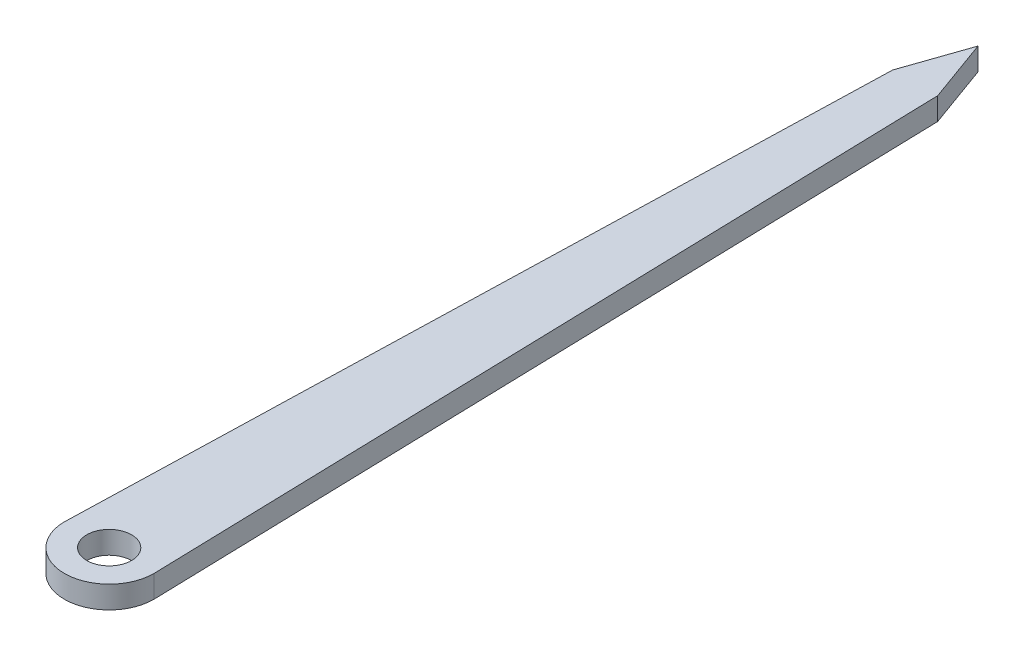
ISO-10303-21;
HEADER;
FILE_DESCRIPTION(('STEP AP214'),'2;1');
FILE_NAME('part.step','',(''),(''),'','','');
FILE_SCHEMA(('AUTOMOTIVE_DESIGN { 1 0 10303 214 1 1 1 1 }'));
ENDSEC;
DATA;
#1=APPLICATION_CONTEXT('core data for automotive mechanical design processes');
#2=APPLICATION_PROTOCOL_DEFINITION('international standard','automotive_design',2000,#1);
#3=PRODUCT_CONTEXT('',#1,'mechanical');
#4=PRODUCT('Part','Part','',(#3));
#5=PRODUCT_RELATED_PRODUCT_CATEGORY('part','',(#4));
#6=PRODUCT_DEFINITION_FORMATION('','',#4);
#7=PRODUCT_DEFINITION_CONTEXT('part definition',#1,'design');
#8=PRODUCT_DEFINITION('design','',#6,#7);
#9=PRODUCT_DEFINITION_SHAPE('','',#8);
#10=(LENGTH_UNIT() NAMED_UNIT(*) SI_UNIT(.MILLI.,.METRE.));
#11=(NAMED_UNIT(*) PLANE_ANGLE_UNIT() SI_UNIT($,.RADIAN.));
#12=(NAMED_UNIT(*) SI_UNIT($,.STERADIAN.) SOLID_ANGLE_UNIT());
#13=UNCERTAINTY_MEASURE_WITH_UNIT(LENGTH_MEASURE(1.E-05),#10,'distance_accuracy_value','');
#14=(GEOMETRIC_REPRESENTATION_CONTEXT(3) GLOBAL_UNCERTAINTY_ASSIGNED_CONTEXT((#13)) GLOBAL_UNIT_ASSIGNED_CONTEXT((#10,
#11,#12)) REPRESENTATION_CONTEXT('',''));
#15=CARTESIAN_POINT('',(0.,0.,0.));
#16=DIRECTION('',(0.,0.,1.));
#17=DIRECTION('',(1.,0.,0.));
#18=AXIS2_PLACEMENT_3D('',#15,#16,#17);
#19=CARTESIAN_POINT('',(104.951451368837,2.,2.97615330015618));
#20=DIRECTION('',(-0.999598170448803,0.,-0.028346033856704));
#21=DIRECTION('',(-0.028346033856704,0.,0.999598170448803));
#22=AXIS2_PLACEMENT_3D('',#19,#20,#21);
#23=PLANE('',#22);
#24=DIRECTION('',(0.028346033856704,0.,-0.999598170448803));
#25=VECTOR('',#24,1.);
#26=CARTESIAN_POINT('',(104.951451368837,0.,2.97615330015618));
#27=LINE('',#26,#25);
#28=CARTESIAN_POINT('',(106.,0.,-34.));
#29=VERTEX_POINT('',#28);
#30=CARTESIAN_POINT('',(108.040914437683,0.,-105.971068272314));
#31=VERTEX_POINT('',#30);
#32=EDGE_CURVE('E113',#29,#31,#27,.T.);
#33=ORIENTED_EDGE('',*,*,#32,.F.);
#34=DIRECTION('',(0.,-1.,0.));
#35=VECTOR('',#34,1.);
#36=CARTESIAN_POINT('',(106.,2.,-34.));
#37=LINE('',#36,#35);
#38=CARTESIAN_POINT('',(106.,2.,-34.));
#39=VERTEX_POINT('',#38);
#40=EDGE_CURVE('E11',#39,#29,#37,.T.);
#41=ORIENTED_EDGE('',*,*,#40,.F.);
#42=DIRECTION('',(0.028346033856704,0.,-0.999598170448803));
#43=VECTOR('',#42,1.);
#44=CARTESIAN_POINT('',(104.951451368837,2.,2.97615330015618));
#45=LINE('',#44,#43);
#46=CARTESIAN_POINT('',(108.040914437683,2.,-105.971068272314));
#47=VERTEX_POINT('',#46);
#48=EDGE_CURVE('E126',#39,#47,#45,.T.);
#49=ORIENTED_EDGE('',*,*,#48,.T.);
#50=DIRECTION('',(0.,-1.,0.));
#51=VECTOR('',#50,1.);
#52=CARTESIAN_POINT('',(108.040914437683,2.,-105.971068272314));
#53=LINE('',#52,#51);
#54=EDGE_CURVE('E51',#47,#31,#53,.T.);
#55=ORIENTED_EDGE('',*,*,#54,.T.);
#56=EDGE_LOOP('',(#33,#41,#49,#55));
#57=FACE_BOUND('',#56,.T.);
#58=ADVANCED_FACE('F35',(#57),#23,.T.);
#59=CARTESIAN_POINT('',(110.,2.,-34.));
#60=DIRECTION('',(0.,-1.,0.));
#61=DIRECTION('',(0.,0.,-1.));
#62=AXIS2_PLACEMENT_3D('',#59,#60,#61);
#63=CYLINDRICAL_SURFACE('',#62,3.99999999999999);
#64=CARTESIAN_POINT('',(110.,0.,-34.));
#65=DIRECTION('',(0.,1.,0.));
#66=DIRECTION('',(0.,0.,1.));
#67=AXIS2_PLACEMENT_3D('',#64,#65,#66);
#68=CIRCLE('',#67,3.99999999999999);
#69=CARTESIAN_POINT('',(114.,0.,-34.));
#70=VERTEX_POINT('',#69);
#71=EDGE_CURVE('E115',#29,#70,#68,.T.);
#72=ORIENTED_EDGE('',*,*,#71,.T.);
#73=DIRECTION('',(0.,-1.,0.));
#74=VECTOR('',#73,1.);
#75=CARTESIAN_POINT('',(114.,2.,-34.));
#76=LINE('',#75,#74);
#77=CARTESIAN_POINT('',(114.,2.,-34.));
#78=VERTEX_POINT('',#77);
#79=EDGE_CURVE('E43',#78,#70,#76,.T.);
#80=ORIENTED_EDGE('',*,*,#79,.F.);
#81=CARTESIAN_POINT('',(110.,2.,-34.));
#82=DIRECTION('',(0.,1.,0.));
#83=DIRECTION('',(0.,0.,1.));
#84=AXIS2_PLACEMENT_3D('',#81,#82,#83);
#85=CIRCLE('',#84,3.99999999999999);
#86=EDGE_CURVE('E91',#39,#78,#85,.T.);
#87=ORIENTED_EDGE('',*,*,#86,.F.);
#88=ORIENTED_EDGE('',*,*,#40,.T.);
#89=EDGE_LOOP('',(#72,#80,#87,#88));
#90=FACE_BOUND('',#89,.T.);
#91=ADVANCED_FACE('F145',(#90),#63,.T.);
#92=CARTESIAN_POINT('',(114.840100942145,2.,-3.12474421848353));
#93=DIRECTION('',(-0.999630026386503,0.,0.0271994548937866));
#94=DIRECTION('',(0.0271994548937866,0.,0.999630026386503));
#95=AXIS2_PLACEMENT_3D('',#92,#93,#94);
#96=PLANE('',#95);
#97=DIRECTION('',(-0.0271994548937866,0.,-0.999630026386503));
#98=VECTOR('',#97,1.);
#99=CARTESIAN_POINT('',(114.840100942145,0.,-3.12474421848353));
#100=LINE('',#99,#98);
#101=CARTESIAN_POINT('',(112.040914437683,0.,-106.));
#102=VERTEX_POINT('',#101);
#103=EDGE_CURVE('E100',#70,#102,#100,.T.);
#104=ORIENTED_EDGE('',*,*,#103,.T.);
#105=DIRECTION('',(0.,-1.,0.));
#106=VECTOR('',#105,1.);
#107=CARTESIAN_POINT('',(112.040914437683,2.,-106.));
#108=LINE('',#107,#106);
#109=CARTESIAN_POINT('',(112.040914437683,2.,-106.));
#110=VERTEX_POINT('',#109);
#111=EDGE_CURVE('E97',#110,#102,#108,.T.);
#112=ORIENTED_EDGE('',*,*,#111,.F.);
#113=DIRECTION('',(-0.0271994548937866,0.,-0.999630026386503));
#114=VECTOR('',#113,1.);
#115=CARTESIAN_POINT('',(114.840100942145,2.,-3.12474421848353));
#116=LINE('',#115,#114);
#117=EDGE_CURVE('E83',#78,#110,#116,.T.);
#118=ORIENTED_EDGE('',*,*,#117,.F.);
#119=ORIENTED_EDGE('',*,*,#79,.T.);
#120=EDGE_LOOP('',(#104,#112,#118,#119));
#121=FACE_BOUND('',#120,.T.);
#122=ADVANCED_FACE('F98',(#121),#96,.F.);
#123=CARTESIAN_POINT('',(132.983508734658,2.,-48.1030286521325));
#124=DIRECTION('',(-0.940370320938311,0.,0.340152406280447));
#125=DIRECTION('',(0.340152406280447,0.,0.940370320938311));
#126=AXIS2_PLACEMENT_3D('',#123,#124,#125);
#127=PLANE('',#126);
#128=DIRECTION('',(-0.340152406280447,0.,-0.940370320938311));
#129=VECTOR('',#128,1.);
#130=CARTESIAN_POINT('',(132.983508734658,0.,-48.1030286521325));
#131=LINE('',#130,#129);
#132=CARTESIAN_POINT('',(110.,0.,-111.64222192563));
#133=VERTEX_POINT('',#132);
#134=EDGE_CURVE('E118',#102,#133,#131,.T.);
#135=ORIENTED_EDGE('',*,*,#134,.T.);
#136=DIRECTION('',(0.,-1.,0.));
#137=VECTOR('',#136,1.);
#138=CARTESIAN_POINT('',(110.,2.,-111.64222192563));
#139=LINE('',#138,#137);
#140=CARTESIAN_POINT('',(110.,2.,-111.64222192563));
#141=VERTEX_POINT('',#140);
#142=EDGE_CURVE('E68',#141,#133,#139,.T.);
#143=ORIENTED_EDGE('',*,*,#142,.F.);
#144=DIRECTION('',(-0.340152406280447,0.,-0.940370320938311));
#145=VECTOR('',#144,1.);
#146=CARTESIAN_POINT('',(132.983508734658,2.,-48.1030286521325));
#147=LINE('',#146,#145);
#148=EDGE_CURVE('E90',#110,#141,#147,.T.);
#149=ORIENTED_EDGE('',*,*,#148,.F.);
#150=ORIENTED_EDGE('',*,*,#111,.T.);
#151=EDGE_LOOP('',(#135,#143,#149,#150));
#152=FACE_BOUND('',#151,.T.);
#153=ADVANCED_FACE('F104',(#152),#127,.F.);
#154=CARTESIAN_POINT('',(63.8178444198189,2.,22.0457115542929));
#155=DIRECTION('',(-0.945192275552673,0.,-0.326514260386219));
#156=DIRECTION('',(-0.326514260386219,0.,0.945192275552673));
#157=AXIS2_PLACEMENT_3D('',#154,#155,#156);
#158=PLANE('',#157);
#159=DIRECTION('',(0.326514260386219,0.,-0.945192275552673));
#160=VECTOR('',#159,1.);
#161=CARTESIAN_POINT('',(63.8178444198189,0.,22.0457115542929));
#162=LINE('',#161,#160);
#163=EDGE_CURVE('E120',#31,#133,#162,.T.);
#164=ORIENTED_EDGE('',*,*,#163,.F.);
#165=ORIENTED_EDGE('',*,*,#54,.F.);
#166=DIRECTION('',(0.326514260386219,0.,-0.945192275552673));
#167=VECTOR('',#166,1.);
#168=CARTESIAN_POINT('',(63.8178444198189,2.,22.0457115542929));
#169=LINE('',#168,#167);
#170=EDGE_CURVE('E105',#47,#141,#169,.T.);
#171=ORIENTED_EDGE('',*,*,#170,.T.);
#172=ORIENTED_EDGE('',*,*,#142,.T.);
#173=EDGE_LOOP('',(#164,#165,#171,#172));
#174=FACE_BOUND('',#173,.T.);
#175=ADVANCED_FACE('F133',(#174),#158,.T.);
#176=CARTESIAN_POINT('',(110.,2.,-34.));
#177=DIRECTION('',(0.,-1.,0.));
#178=DIRECTION('',(0.,0.,-1.));
#179=AXIS2_PLACEMENT_3D('',#176,#177,#178);
#180=CYLINDRICAL_SURFACE('',#179,2.00000000000001);
#181=CARTESIAN_POINT('',(110.,2.,-34.));
#182=DIRECTION('',(0.,1.,0.));
#183=DIRECTION('',(0.,0.,1.));
#184=AXIS2_PLACEMENT_3D('',#181,#182,#183);
#185=CIRCLE('',#184,2.00000000000001);
#186=CARTESIAN_POINT('',(110.,2.,-32.));
#187=VERTEX_POINT('',#186);
#188=EDGE_CURVE('E107',#187,#187,#185,.T.);
#189=ORIENTED_EDGE('',*,*,#188,.T.);
#190=EDGE_LOOP('',(#189));
#191=FACE_BOUND('',#190,.T.);
#192=CARTESIAN_POINT('',(110.,0.,-34.));
#193=DIRECTION('',(0.,1.,0.));
#194=DIRECTION('',(0.,0.,1.));
#195=AXIS2_PLACEMENT_3D('',#192,#193,#194);
#196=CIRCLE('',#195,2.00000000000001);
#197=CARTESIAN_POINT('',(110.,0.,-32.));
#198=VERTEX_POINT('',#197);
#199=EDGE_CURVE('E123',#198,#198,#196,.T.);
#200=ORIENTED_EDGE('',*,*,#199,.F.);
#201=EDGE_LOOP('',(#200));
#202=FACE_BOUND('',#201,.T.);
#203=ADVANCED_FACE('F135',(#191,#202),#180,.F.);
#204=CARTESIAN_POINT('',(0.,2.,0.));
#205=DIRECTION('',(0.,1.,0.));
#206=DIRECTION('',(0.,0.,1.));
#207=AXIS2_PLACEMENT_3D('',#204,#205,#206);
#208=PLANE('',#207);
#209=ORIENTED_EDGE('',*,*,#48,.F.);
#210=ORIENTED_EDGE('',*,*,#86,.T.);
#211=ORIENTED_EDGE('',*,*,#117,.T.);
#212=ORIENTED_EDGE('',*,*,#148,.T.);
#213=ORIENTED_EDGE('',*,*,#170,.F.);
#214=EDGE_LOOP('',(#209,#210,#211,#212,#213));
#215=FACE_BOUND('',#214,.T.);
#216=ORIENTED_EDGE('',*,*,#188,.F.);
#217=EDGE_LOOP('',(#216));
#218=FACE_BOUND('',#217,.T.);
#219=ADVANCED_FACE('F86',(#215,#218),#208,.T.);
#220=CARTESIAN_POINT('',(0.,0.,0.));
#221=DIRECTION('',(0.,1.,0.));
#222=DIRECTION('',(0.,0.,1.));
#223=AXIS2_PLACEMENT_3D('',#220,#221,#222);
#224=PLANE('',#223);
#225=ORIENTED_EDGE('',*,*,#32,.T.);
#226=ORIENTED_EDGE('',*,*,#163,.T.);
#227=ORIENTED_EDGE('',*,*,#134,.F.);
#228=ORIENTED_EDGE('',*,*,#103,.F.);
#229=ORIENTED_EDGE('',*,*,#71,.F.);
#230=EDGE_LOOP('',(#225,#226,#227,#228,#229));
#231=FACE_BOUND('',#230,.T.);
#232=ORIENTED_EDGE('',*,*,#199,.T.);
#233=EDGE_LOOP('',(#232));
#234=FACE_BOUND('',#233,.T.);
#235=ADVANCED_FACE('F131',(#231,#234),#224,.F.);
#236=CLOSED_SHELL('',(#58,#91,#122,#153,#175,#203,#219,#235));
#237=MANIFOLD_SOLID_BREP('B2',#236);
#238=ADVANCED_BREP_SHAPE_REPRESENTATION('',(#18,#237),#14);
#239=SHAPE_DEFINITION_REPRESENTATION(#9,#238);
ENDSEC;
END-ISO-10303-21;
